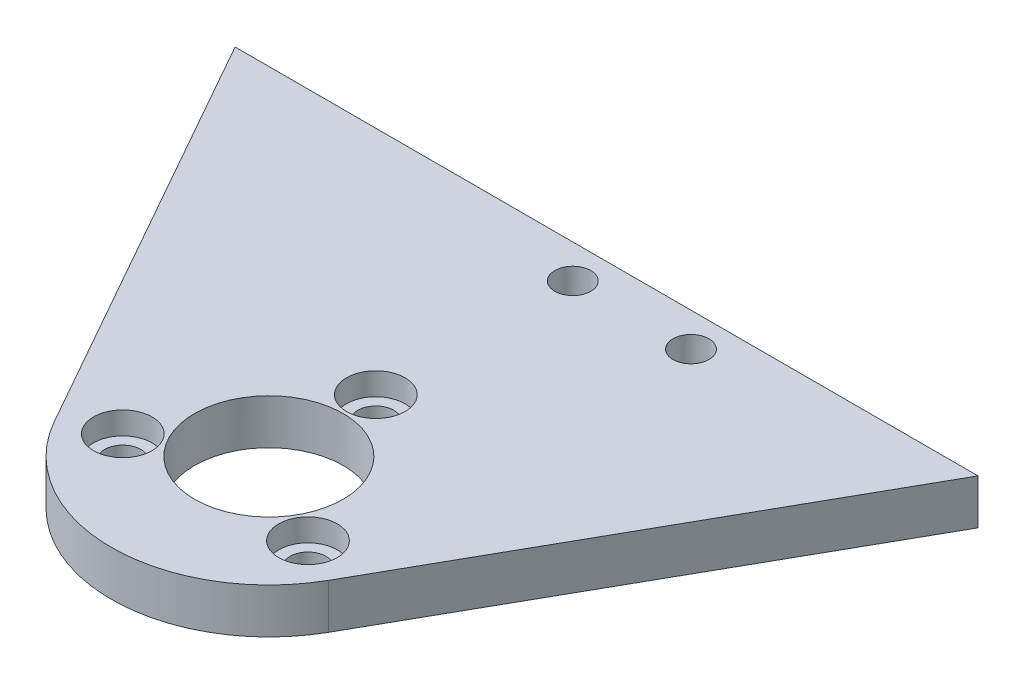
ISO-10303-21;
HEADER;
FILE_DESCRIPTION(('STEP AP214'),'2;1');
FILE_NAME('part.step','',(''),(''),'','','');
FILE_SCHEMA(('AUTOMOTIVE_DESIGN { 1 0 10303 214 1 1 1 1 }'));
ENDSEC;
DATA;
#1=APPLICATION_CONTEXT('core data for automotive mechanical design processes');
#2=APPLICATION_PROTOCOL_DEFINITION('international standard','automotive_design',2000,#1);
#3=PRODUCT_CONTEXT('',#1,'mechanical');
#4=PRODUCT('Part','Part','',(#3));
#5=PRODUCT_RELATED_PRODUCT_CATEGORY('part','',(#4));
#6=PRODUCT_DEFINITION_FORMATION('','',#4);
#7=PRODUCT_DEFINITION_CONTEXT('part definition',#1,'design');
#8=PRODUCT_DEFINITION('design','',#6,#7);
#9=PRODUCT_DEFINITION_SHAPE('','',#8);
#10=(LENGTH_UNIT() NAMED_UNIT(*) SI_UNIT(.MILLI.,.METRE.));
#11=(NAMED_UNIT(*) PLANE_ANGLE_UNIT() SI_UNIT($,.RADIAN.));
#12=(NAMED_UNIT(*) SI_UNIT($,.STERADIAN.) SOLID_ANGLE_UNIT());
#13=UNCERTAINTY_MEASURE_WITH_UNIT(LENGTH_MEASURE(1.E-05),#10,'distance_accuracy_value','');
#14=(GEOMETRIC_REPRESENTATION_CONTEXT(3) GLOBAL_UNCERTAINTY_ASSIGNED_CONTEXT((#13)) GLOBAL_UNIT_ASSIGNED_CONTEXT((#10,
#11,#12)) REPRESENTATION_CONTEXT('',''));
#15=CARTESIAN_POINT('',(0.,0.,0.));
#16=DIRECTION('',(0.,0.,1.));
#17=DIRECTION('',(1.,0.,0.));
#18=AXIS2_PLACEMENT_3D('',#15,#16,#17);
#19=CARTESIAN_POINT('',(0.,-18.6676190233249,-9.5));
#20=DIRECTION('',(0.,1.,0.));
#21=DIRECTION('',(0.,0.,1.));
#22=AXIS2_PLACEMENT_3D('',#19,#20,#21);
#23=CYLINDRICAL_SURFACE('',#22,1.6);
#24=CARTESIAN_POINT('',(0.,0.,-9.5));
#25=DIRECTION('',(0.,-1.,0.));
#26=DIRECTION('',(0.,0.,-1.));
#27=AXIS2_PLACEMENT_3D('',#24,#25,#26);
#28=CIRCLE('',#27,1.6);
#29=CARTESIAN_POINT('',(0.,0.,-11.1));
#30=VERTEX_POINT('',#29);
#31=EDGE_CURVE('E151',#30,#30,#28,.F.);
#32=ORIENTED_EDGE('',*,*,#31,.F.);
#33=EDGE_LOOP('',(#32));
#34=FACE_BOUND('',#33,.T.);
#35=CARTESIAN_POINT('',(0.,2.,-9.5));
#36=DIRECTION('',(0.,1.,0.));
#37=DIRECTION('',(0.,0.,1.));
#38=AXIS2_PLACEMENT_3D('',#35,#36,#37);
#39=CIRCLE('',#38,1.6);
#40=CARTESIAN_POINT('',(0.,2.,-7.9));
#41=VERTEX_POINT('',#40);
#42=EDGE_CURVE('E47',#41,#41,#39,.F.);
#43=ORIENTED_EDGE('',*,*,#42,.F.);
#44=EDGE_LOOP('',(#43));
#45=FACE_BOUND('',#44,.T.);
#46=ADVANCED_FACE('F43',(#34,#45),#23,.F.);
#47=CARTESIAN_POINT('',(8.22724133595217,-18.6676190233249,4.75000000000001));
#48=DIRECTION('',(0.,1.,0.));
#49=DIRECTION('',(0.,0.,1.));
#50=AXIS2_PLACEMENT_3D('',#47,#48,#49);
#51=CYLINDRICAL_SURFACE('',#50,1.6);
#52=CARTESIAN_POINT('',(8.22724133595217,0.,4.75000000000001));
#53=DIRECTION('',(0.,-1.,0.));
#54=DIRECTION('',(0.,0.,-1.));
#55=AXIS2_PLACEMENT_3D('',#52,#53,#54);
#56=CIRCLE('',#55,1.6);
#57=CARTESIAN_POINT('',(8.22724133595217,0.,3.15000000000001));
#58=VERTEX_POINT('',#57);
#59=EDGE_CURVE('E144',#58,#58,#56,.F.);
#60=ORIENTED_EDGE('',*,*,#59,.F.);
#61=EDGE_LOOP('',(#60));
#62=FACE_BOUND('',#61,.T.);
#63=CARTESIAN_POINT('',(8.22724133595217,2.,4.75000000000001));
#64=DIRECTION('',(0.,1.,0.));
#65=DIRECTION('',(0.,0.,1.));
#66=AXIS2_PLACEMENT_3D('',#63,#64,#65);
#67=CIRCLE('',#66,1.6);
#68=CARTESIAN_POINT('',(8.22724133595217,2.,6.35));
#69=VERTEX_POINT('',#68);
#70=EDGE_CURVE('E121',#69,#69,#67,.F.);
#71=ORIENTED_EDGE('',*,*,#70,.F.);
#72=EDGE_LOOP('',(#71));
#73=FACE_BOUND('',#72,.T.);
#74=ADVANCED_FACE('F223',(#62,#73),#51,.F.);
#75=CARTESIAN_POINT('',(-8.22724133595217,-18.6676190233249,4.75));
#76=DIRECTION('',(0.,1.,0.));
#77=DIRECTION('',(0.,0.,1.));
#78=AXIS2_PLACEMENT_3D('',#75,#76,#77);
#79=CYLINDRICAL_SURFACE('',#78,1.6);
#80=CARTESIAN_POINT('',(-8.22724133595217,0.,4.75));
#81=DIRECTION('',(0.,-1.,0.));
#82=DIRECTION('',(0.,0.,-1.));
#83=AXIS2_PLACEMENT_3D('',#80,#81,#82);
#84=CIRCLE('',#83,1.6);
#85=CARTESIAN_POINT('',(-8.22724133595217,0.,3.15));
#86=VERTEX_POINT('',#85);
#87=EDGE_CURVE('E113',#86,#86,#84,.F.);
#88=ORIENTED_EDGE('',*,*,#87,.F.);
#89=EDGE_LOOP('',(#88));
#90=FACE_BOUND('',#89,.T.);
#91=CARTESIAN_POINT('',(-8.22724133595217,2.,4.75));
#92=DIRECTION('',(0.,1.,0.));
#93=DIRECTION('',(0.,0.,1.));
#94=AXIS2_PLACEMENT_3D('',#91,#92,#93);
#95=CIRCLE('',#94,1.6);
#96=CARTESIAN_POINT('',(-8.22724133595217,2.,6.35));
#97=VERTEX_POINT('',#96);
#98=EDGE_CURVE('E119',#97,#97,#95,.F.);
#99=ORIENTED_EDGE('',*,*,#98,.F.);
#100=EDGE_LOOP('',(#99));
#101=FACE_BOUND('',#100,.T.);
#102=ADVANCED_FACE('F229',(#90,#101),#79,.F.);
#103=CARTESIAN_POINT('',(0.,4.,0.));
#104=DIRECTION('',(0.,-1.,0.));
#105=DIRECTION('',(0.,0.,-1.));
#106=AXIS2_PLACEMENT_3D('',#103,#104,#105);
#107=CYLINDRICAL_SURFACE('',#106,14.);
#108=CARTESIAN_POINT('',(0.,0.,0.));
#109=DIRECTION('',(0.,1.,0.));
#110=DIRECTION('',(0.,0.,-1.));
#111=AXIS2_PLACEMENT_3D('',#108,#109,#110);
#112=CIRCLE('',#111,14.);
#113=CARTESIAN_POINT('',(-12.1932674219114,0.,6.87926083076917));
#114=VERTEX_POINT('',#113);
#115=CARTESIAN_POINT('',(12.1932674219114,0.,6.87926083076916));
#116=VERTEX_POINT('',#115);
#117=EDGE_CURVE('E110',#114,#116,#112,.T.);
#118=ORIENTED_EDGE('',*,*,#117,.T.);
#119=DIRECTION('',(0.,-1.,0.));
#120=VECTOR('',#119,1.);
#121=CARTESIAN_POINT('',(12.1932674219114,4.,6.87926083076916));
#122=LINE('',#121,#120);
#123=CARTESIAN_POINT('',(12.1932674219114,4.,6.87926083076916));
#124=VERTEX_POINT('',#123);
#125=EDGE_CURVE('E11',#124,#116,#122,.T.);
#126=ORIENTED_EDGE('',*,*,#125,.F.);
#127=CARTESIAN_POINT('',(0.,4.,0.));
#128=DIRECTION('',(0.,1.,0.));
#129=DIRECTION('',(0.,0.,-1.));
#130=AXIS2_PLACEMENT_3D('',#127,#128,#129);
#131=CIRCLE('',#130,14.);
#132=CARTESIAN_POINT('',(-12.1932674219114,4.,6.87926083076917));
#133=VERTEX_POINT('',#132);
#134=EDGE_CURVE('E97',#133,#124,#131,.T.);
#135=ORIENTED_EDGE('',*,*,#134,.F.);
#136=DIRECTION('',(0.,-1.,0.));
#137=VECTOR('',#136,1.);
#138=CARTESIAN_POINT('',(-12.1932674219114,4.,6.87926083076917));
#139=LINE('',#138,#137);
#140=EDGE_CURVE('E106',#133,#114,#139,.T.);
#141=ORIENTED_EDGE('',*,*,#140,.T.);
#142=EDGE_LOOP('',(#118,#126,#135,#141));
#143=FACE_BOUND('',#142,.T.);
#144=ADVANCED_FACE('F45',(#143),#107,.T.);
#145=CARTESIAN_POINT('',(33.,4.,-30.));
#146=DIRECTION('',(-0.870947672993669,0.,-0.491375773626369));
#147=DIRECTION('',(-0.491375773626369,0.,0.870947672993669));
#148=AXIS2_PLACEMENT_3D('',#145,#146,#147);
#149=PLANE('',#148);
#150=DIRECTION('',(0.491375773626369,0.,-0.870947672993669));
#151=VECTOR('',#150,1.);
#152=CARTESIAN_POINT('',(33.,0.,-30.));
#153=LINE('',#152,#151);
#154=CARTESIAN_POINT('',(33.,0.,-30.));
#155=VERTEX_POINT('',#154);
#156=EDGE_CURVE('E101',#116,#155,#153,.T.);
#157=ORIENTED_EDGE('',*,*,#156,.T.);
#158=DIRECTION('',(0.,-1.,0.));
#159=VECTOR('',#158,1.);
#160=CARTESIAN_POINT('',(33.,4.,-30.));
#161=LINE('',#160,#159);
#162=CARTESIAN_POINT('',(33.,4.,-30.));
#163=VERTEX_POINT('',#162);
#164=EDGE_CURVE('E53',#163,#155,#161,.T.);
#165=ORIENTED_EDGE('',*,*,#164,.F.);
#166=DIRECTION('',(0.491375773626369,0.,-0.870947672993669));
#167=VECTOR('',#166,1.);
#168=CARTESIAN_POINT('',(33.,4.,-30.));
#169=LINE('',#168,#167);
#170=EDGE_CURVE('E92',#124,#163,#169,.T.);
#171=ORIENTED_EDGE('',*,*,#170,.F.);
#172=ORIENTED_EDGE('',*,*,#125,.T.);
#173=EDGE_LOOP('',(#157,#165,#171,#172));
#174=FACE_BOUND('',#173,.T.);
#175=ADVANCED_FACE('F100',(#174),#149,.F.);
#176=CARTESIAN_POINT('',(-33.,4.,-30.));
#177=DIRECTION('',(0.,0.,1.));
#178=DIRECTION('',(1.,0.,0.));
#179=AXIS2_PLACEMENT_3D('',#176,#177,#178);
#180=PLANE('',#179);
#181=DIRECTION('',(-1.,0.,0.));
#182=VECTOR('',#181,1.);
#183=CARTESIAN_POINT('',(-33.,0.,-30.));
#184=LINE('',#183,#182);
#185=CARTESIAN_POINT('',(-33.,0.,-30.));
#186=VERTEX_POINT('',#185);
#187=EDGE_CURVE('E79',#155,#186,#184,.T.);
#188=ORIENTED_EDGE('',*,*,#187,.T.);
#189=DIRECTION('',(0.,-1.,0.));
#190=VECTOR('',#189,1.);
#191=CARTESIAN_POINT('',(-33.,4.,-30.));
#192=LINE('',#191,#190);
#193=CARTESIAN_POINT('',(-33.,4.,-30.));
#194=VERTEX_POINT('',#193);
#195=EDGE_CURVE('E102',#194,#186,#192,.T.);
#196=ORIENTED_EDGE('',*,*,#195,.F.);
#197=DIRECTION('',(-1.,0.,0.));
#198=VECTOR('',#197,1.);
#199=CARTESIAN_POINT('',(-33.,4.,-30.));
#200=LINE('',#199,#198);
#201=EDGE_CURVE('E95',#163,#194,#200,.T.);
#202=ORIENTED_EDGE('',*,*,#201,.F.);
#203=ORIENTED_EDGE('',*,*,#164,.T.);
#204=EDGE_LOOP('',(#188,#196,#202,#203));
#205=FACE_BOUND('',#204,.T.);
#206=ADVANCED_FACE('F104',(#205),#180,.F.);
#207=CARTESIAN_POINT('',(-12.1932674219114,4.,6.87926083076917));
#208=DIRECTION('',(0.870947672993669,0.,-0.491375773626369));
#209=DIRECTION('',(-0.491375773626369,0.,-0.870947672993669));
#210=AXIS2_PLACEMENT_3D('',#207,#208,#209);
#211=PLANE('',#210);
#212=DIRECTION('',(0.491375773626369,0.,0.870947672993669));
#213=VECTOR('',#212,1.);
#214=CARTESIAN_POINT('',(-12.1932674219114,0.,6.87926083076917));
#215=LINE('',#214,#213);
#216=EDGE_CURVE('E85',#186,#114,#215,.T.);
#217=ORIENTED_EDGE('',*,*,#216,.T.);
#218=ORIENTED_EDGE('',*,*,#140,.F.);
#219=DIRECTION('',(0.491375773626369,0.,0.870947672993669));
#220=VECTOR('',#219,1.);
#221=CARTESIAN_POINT('',(-12.1932674219114,4.,6.87926083076917));
#222=LINE('',#221,#220);
#223=EDGE_CURVE('E62',#194,#133,#222,.T.);
#224=ORIENTED_EDGE('',*,*,#223,.F.);
#225=ORIENTED_EDGE('',*,*,#195,.T.);
#226=EDGE_LOOP('',(#217,#218,#224,#225));
#227=FACE_BOUND('',#226,.T.);
#228=ADVANCED_FACE('F193',(#227),#211,.F.);
#229=CARTESIAN_POINT('',(0.,4.,0.));
#230=DIRECTION('',(0.,-1.,0.));
#231=DIRECTION('',(0.,0.,-1.));
#232=AXIS2_PLACEMENT_3D('',#229,#230,#231);
#233=PLANE('',#232);
#234=CARTESIAN_POINT('',(0.,4.,-9.5));
#235=DIRECTION('',(0.,1.,0.));
#236=DIRECTION('',(0.,0.,1.));
#237=AXIS2_PLACEMENT_3D('',#234,#235,#236);
#238=CIRCLE('',#237,2.6);
#239=CARTESIAN_POINT('',(0.,4.,-6.9));
#240=VERTEX_POINT('',#239);
#241=EDGE_CURVE('E176',#240,#240,#238,.T.);
#242=ORIENTED_EDGE('',*,*,#241,.F.);
#243=EDGE_LOOP('',(#242));
#244=FACE_BOUND('',#243,.T.);
#245=CARTESIAN_POINT('',(8.22724133595217,4.,4.75000000000001));
#246=DIRECTION('',(0.,1.,0.));
#247=DIRECTION('',(0.,0.,1.));
#248=AXIS2_PLACEMENT_3D('',#245,#246,#247);
#249=CIRCLE('',#248,2.6);
#250=CARTESIAN_POINT('',(8.22724133595217,4.,7.35));
#251=VERTEX_POINT('',#250);
#252=EDGE_CURVE('E173',#251,#251,#249,.T.);
#253=ORIENTED_EDGE('',*,*,#252,.F.);
#254=EDGE_LOOP('',(#253));
#255=FACE_BOUND('',#254,.T.);
#256=CARTESIAN_POINT('',(-8.22724133595217,4.,4.75));
#257=DIRECTION('',(0.,1.,0.));
#258=DIRECTION('',(0.,0.,1.));
#259=AXIS2_PLACEMENT_3D('',#256,#257,#258);
#260=CIRCLE('',#259,2.6);
#261=CARTESIAN_POINT('',(-8.22724133595217,4.,7.35));
#262=VERTEX_POINT('',#261);
#263=EDGE_CURVE('E167',#262,#262,#260,.T.);
#264=ORIENTED_EDGE('',*,*,#263,.F.);
#265=EDGE_LOOP('',(#264));
#266=FACE_BOUND('',#265,.T.);
#267=CARTESIAN_POINT('',(0.,4.,-27.));
#268=DIRECTION('',(0.,1.,0.));
#269=DIRECTION('',(0.,0.,1.));
#270=AXIS2_PLACEMENT_3D('',#267,#268,#269);
#271=CIRCLE('',#270,1.6);
#272=CARTESIAN_POINT('',(0.,4.,-25.4));
#273=VERTEX_POINT('',#272);
#274=EDGE_CURVE('E136',#273,#273,#271,.T.);
#275=ORIENTED_EDGE('',*,*,#274,.F.);
#276=EDGE_LOOP('',(#275));
#277=FACE_BOUND('',#276,.T.);
#278=CARTESIAN_POINT('',(10.5,4.,-27.));
#279=DIRECTION('',(0.,1.,0.));
#280=DIRECTION('',(0.,0.,1.));
#281=AXIS2_PLACEMENT_3D('',#278,#279,#280);
#282=CIRCLE('',#281,1.6);
#283=CARTESIAN_POINT('',(10.5,4.,-25.4));
#284=VERTEX_POINT('',#283);
#285=EDGE_CURVE('E131',#284,#284,#282,.T.);
#286=ORIENTED_EDGE('',*,*,#285,.F.);
#287=EDGE_LOOP('',(#286));
#288=FACE_BOUND('',#287,.T.);
#289=CARTESIAN_POINT('',(0.,4.,0.));
#290=DIRECTION('',(0.,1.,0.));
#291=DIRECTION('',(0.,0.,1.));
#292=AXIS2_PLACEMENT_3D('',#289,#290,#291);
#293=CIRCLE('',#292,6.6);
#294=CARTESIAN_POINT('',(0.,4.,6.6));
#295=VERTEX_POINT('',#294);
#296=EDGE_CURVE('E147',#295,#295,#293,.T.);
#297=ORIENTED_EDGE('',*,*,#296,.F.);
#298=EDGE_LOOP('',(#297));
#299=FACE_BOUND('',#298,.T.);
#300=ORIENTED_EDGE('',*,*,#134,.T.);
#301=ORIENTED_EDGE('',*,*,#170,.T.);
#302=ORIENTED_EDGE('',*,*,#201,.T.);
#303=ORIENTED_EDGE('',*,*,#223,.T.);
#304=EDGE_LOOP('',(#300,#301,#302,#303));
#305=FACE_BOUND('',#304,.T.);
#306=ADVANCED_FACE('F93',(#244,#255,#266,#277,#288,#299,#305),#233,.F.);
#307=CARTESIAN_POINT('',(0.,0.,0.));
#308=DIRECTION('',(0.,-1.,0.));
#309=DIRECTION('',(0.,0.,-1.));
#310=AXIS2_PLACEMENT_3D('',#307,#308,#309);
#311=PLANE('',#310);
#312=CARTESIAN_POINT('',(0.,0.,-27.));
#313=DIRECTION('',(0.,-1.,0.));
#314=DIRECTION('',(0.,0.,-1.));
#315=AXIS2_PLACEMENT_3D('',#312,#313,#314);
#316=CIRCLE('',#315,1.6);
#317=CARTESIAN_POINT('',(0.,0.,-28.6));
#318=VERTEX_POINT('',#317);
#319=EDGE_CURVE('E139',#318,#318,#316,.F.);
#320=ORIENTED_EDGE('',*,*,#319,.T.);
#321=EDGE_LOOP('',(#320));
#322=FACE_BOUND('',#321,.T.);
#323=CARTESIAN_POINT('',(10.5,0.,-27.));
#324=DIRECTION('',(0.,-1.,0.));
#325=DIRECTION('',(0.,0.,-1.));
#326=AXIS2_PLACEMENT_3D('',#323,#324,#325);
#327=CIRCLE('',#326,1.6);
#328=CARTESIAN_POINT('',(10.5,0.,-28.6));
#329=VERTEX_POINT('',#328);
#330=EDGE_CURVE('E127',#329,#329,#327,.F.);
#331=ORIENTED_EDGE('',*,*,#330,.T.);
#332=EDGE_LOOP('',(#331));
#333=FACE_BOUND('',#332,.T.);
#334=ORIENTED_EDGE('',*,*,#87,.T.);
#335=EDGE_LOOP('',(#334));
#336=FACE_BOUND('',#335,.T.);
#337=ORIENTED_EDGE('',*,*,#59,.T.);
#338=EDGE_LOOP('',(#337));
#339=FACE_BOUND('',#338,.T.);
#340=CARTESIAN_POINT('',(0.,0.,0.));
#341=DIRECTION('',(0.,-1.,0.));
#342=DIRECTION('',(0.,0.,-1.));
#343=AXIS2_PLACEMENT_3D('',#340,#341,#342);
#344=CIRCLE('',#343,6.6);
#345=CARTESIAN_POINT('',(0.,0.,-6.6));
#346=VERTEX_POINT('',#345);
#347=EDGE_CURVE('E148',#346,#346,#344,.F.);
#348=ORIENTED_EDGE('',*,*,#347,.T.);
#349=EDGE_LOOP('',(#348));
#350=FACE_BOUND('',#349,.T.);
#351=ORIENTED_EDGE('',*,*,#31,.T.);
#352=EDGE_LOOP('',(#351));
#353=FACE_BOUND('',#352,.T.);
#354=ORIENTED_EDGE('',*,*,#117,.F.);
#355=ORIENTED_EDGE('',*,*,#216,.F.);
#356=ORIENTED_EDGE('',*,*,#187,.F.);
#357=ORIENTED_EDGE('',*,*,#156,.F.);
#358=EDGE_LOOP('',(#354,#355,#356,#357));
#359=FACE_BOUND('',#358,.T.);
#360=ADVANCED_FACE('F192',(#322,#333,#336,#339,#350,#353,#359),#311,.T.);
#361=CARTESIAN_POINT('',(0.,-18.6676190233249,0.));
#362=DIRECTION('',(0.,1.,0.));
#363=DIRECTION('',(0.,0.,1.));
#364=AXIS2_PLACEMENT_3D('',#361,#362,#363);
#365=CYLINDRICAL_SURFACE('',#364,6.6);
#366=ORIENTED_EDGE('',*,*,#296,.T.);
#367=EDGE_LOOP('',(#366));
#368=FACE_BOUND('',#367,.T.);
#369=ORIENTED_EDGE('',*,*,#347,.F.);
#370=EDGE_LOOP('',(#369));
#371=FACE_BOUND('',#370,.T.);
#372=ADVANCED_FACE('F204',(#368,#371),#365,.F.);
#373=CARTESIAN_POINT('',(10.5,-4.52548339959391,-27.));
#374=DIRECTION('',(0.,1.,0.));
#375=DIRECTION('',(0.,0.,1.));
#376=AXIS2_PLACEMENT_3D('',#373,#374,#375);
#377=CYLINDRICAL_SURFACE('',#376,1.6);
#378=ORIENTED_EDGE('',*,*,#285,.T.);
#379=EDGE_LOOP('',(#378));
#380=FACE_BOUND('',#379,.T.);
#381=ORIENTED_EDGE('',*,*,#330,.F.);
#382=EDGE_LOOP('',(#381));
#383=FACE_BOUND('',#382,.T.);
#384=ADVANCED_FACE('F207',(#380,#383),#377,.F.);
#385=CARTESIAN_POINT('',(0.,-4.52548339959391,-27.));
#386=DIRECTION('',(0.,1.,0.));
#387=DIRECTION('',(0.,0.,1.));
#388=AXIS2_PLACEMENT_3D('',#385,#386,#387);
#389=CYLINDRICAL_SURFACE('',#388,1.6);
#390=ORIENTED_EDGE('',*,*,#274,.T.);
#391=EDGE_LOOP('',(#390));
#392=FACE_BOUND('',#391,.T.);
#393=ORIENTED_EDGE('',*,*,#319,.F.);
#394=EDGE_LOOP('',(#393));
#395=FACE_BOUND('',#394,.T.);
#396=ADVANCED_FACE('F239',(#392,#395),#389,.F.);
#397=CARTESIAN_POINT('',(-8.22724133595217,2.,4.75));
#398=DIRECTION('',(0.,1.,0.));
#399=DIRECTION('',(0.,0.,1.));
#400=AXIS2_PLACEMENT_3D('',#397,#398,#399);
#401=PLANE('',#400);
#402=CARTESIAN_POINT('',(-8.22724133595217,2.,4.75));
#403=DIRECTION('',(0.,1.,0.));
#404=DIRECTION('',(0.,0.,1.));
#405=AXIS2_PLACEMENT_3D('',#402,#403,#404);
#406=CIRCLE('',#405,2.6);
#407=CARTESIAN_POINT('',(-8.22724133595217,2.,7.35));
#408=VERTEX_POINT('',#407);
#409=EDGE_CURVE('E164',#408,#408,#406,.T.);
#410=ORIENTED_EDGE('',*,*,#409,.T.);
#411=EDGE_LOOP('',(#410));
#412=FACE_BOUND('',#411,.T.);
#413=ORIENTED_EDGE('',*,*,#98,.T.);
#414=EDGE_LOOP('',(#413));
#415=FACE_BOUND('',#414,.T.);
#416=ADVANCED_FACE('F243',(#412,#415),#401,.T.);
#417=CARTESIAN_POINT('',(-8.22724133595217,2.,4.75));
#418=DIRECTION('',(0.,1.,0.));
#419=DIRECTION('',(0.,0.,1.));
#420=AXIS2_PLACEMENT_3D('',#417,#418,#419);
#421=CYLINDRICAL_SURFACE('',#420,2.6);
#422=ORIENTED_EDGE('',*,*,#409,.F.);
#423=EDGE_LOOP('',(#422));
#424=FACE_BOUND('',#423,.T.);
#425=ORIENTED_EDGE('',*,*,#263,.T.);
#426=EDGE_LOOP('',(#425));
#427=FACE_BOUND('',#426,.T.);
#428=ADVANCED_FACE('F246',(#424,#427),#421,.F.);
#429=CARTESIAN_POINT('',(8.22724133595217,2.,4.75000000000001));
#430=DIRECTION('',(0.,1.,0.));
#431=DIRECTION('',(0.,0.,1.));
#432=AXIS2_PLACEMENT_3D('',#429,#430,#431);
#433=PLANE('',#432);
#434=CARTESIAN_POINT('',(8.22724133595217,2.,4.75000000000001));
#435=DIRECTION('',(0.,1.,0.));
#436=DIRECTION('',(0.,0.,1.));
#437=AXIS2_PLACEMENT_3D('',#434,#435,#436);
#438=CIRCLE('',#437,2.6);
#439=CARTESIAN_POINT('',(8.22724133595217,2.,7.35));
#440=VERTEX_POINT('',#439);
#441=EDGE_CURVE('E170',#440,#440,#438,.T.);
#442=ORIENTED_EDGE('',*,*,#441,.T.);
#443=EDGE_LOOP('',(#442));
#444=FACE_BOUND('',#443,.T.);
#445=ORIENTED_EDGE('',*,*,#70,.T.);
#446=EDGE_LOOP('',(#445));
#447=FACE_BOUND('',#446,.T.);
#448=ADVANCED_FACE('F250',(#444,#447),#433,.T.);
#449=CARTESIAN_POINT('',(8.22724133595217,2.,4.75000000000001));
#450=DIRECTION('',(0.,1.,0.));
#451=DIRECTION('',(0.,0.,1.));
#452=AXIS2_PLACEMENT_3D('',#449,#450,#451);
#453=CYLINDRICAL_SURFACE('',#452,2.6);
#454=ORIENTED_EDGE('',*,*,#441,.F.);
#455=EDGE_LOOP('',(#454));
#456=FACE_BOUND('',#455,.T.);
#457=ORIENTED_EDGE('',*,*,#252,.T.);
#458=EDGE_LOOP('',(#457));
#459=FACE_BOUND('',#458,.T.);
#460=ADVANCED_FACE('F254',(#456,#459),#453,.F.);
#461=CARTESIAN_POINT('',(0.,2.,-9.5));
#462=DIRECTION('',(0.,1.,0.));
#463=DIRECTION('',(0.,0.,1.));
#464=AXIS2_PLACEMENT_3D('',#461,#462,#463);
#465=PLANE('',#464);
#466=CARTESIAN_POINT('',(0.,2.,-9.5));
#467=DIRECTION('',(0.,1.,0.));
#468=DIRECTION('',(0.,0.,1.));
#469=AXIS2_PLACEMENT_3D('',#466,#467,#468);
#470=CIRCLE('',#469,2.6);
#471=CARTESIAN_POINT('',(0.,2.,-6.9));
#472=VERTEX_POINT('',#471);
#473=EDGE_CURVE('E122',#472,#472,#470,.T.);
#474=ORIENTED_EDGE('',*,*,#473,.T.);
#475=EDGE_LOOP('',(#474));
#476=FACE_BOUND('',#475,.T.);
#477=ORIENTED_EDGE('',*,*,#42,.T.);
#478=EDGE_LOOP('',(#477));
#479=FACE_BOUND('',#478,.T.);
#480=ADVANCED_FACE('F182',(#476,#479),#465,.T.);
#481=CARTESIAN_POINT('',(0.,2.,-9.5));
#482=DIRECTION('',(0.,1.,0.));
#483=DIRECTION('',(0.,0.,1.));
#484=AXIS2_PLACEMENT_3D('',#481,#482,#483);
#485=CYLINDRICAL_SURFACE('',#484,2.6);
#486=ORIENTED_EDGE('',*,*,#473,.F.);
#487=EDGE_LOOP('',(#486));
#488=FACE_BOUND('',#487,.T.);
#489=ORIENTED_EDGE('',*,*,#241,.T.);
#490=EDGE_LOOP('',(#489));
#491=FACE_BOUND('',#490,.T.);
#492=ADVANCED_FACE('F184',(#488,#491),#485,.F.);
#493=CLOSED_SHELL('',(#46,#74,#102,#144,#175,#206,#228,#306,#360,#372,#384,#396,#416,#428,#448,
#460,#480,#492));
#494=MANIFOLD_SOLID_BREP('B2',#493);
#495=ADVANCED_BREP_SHAPE_REPRESENTATION('',(#18,#494),#14);
#496=SHAPE_DEFINITION_REPRESENTATION(#9,#495);
ENDSEC;
END-ISO-10303-21;
